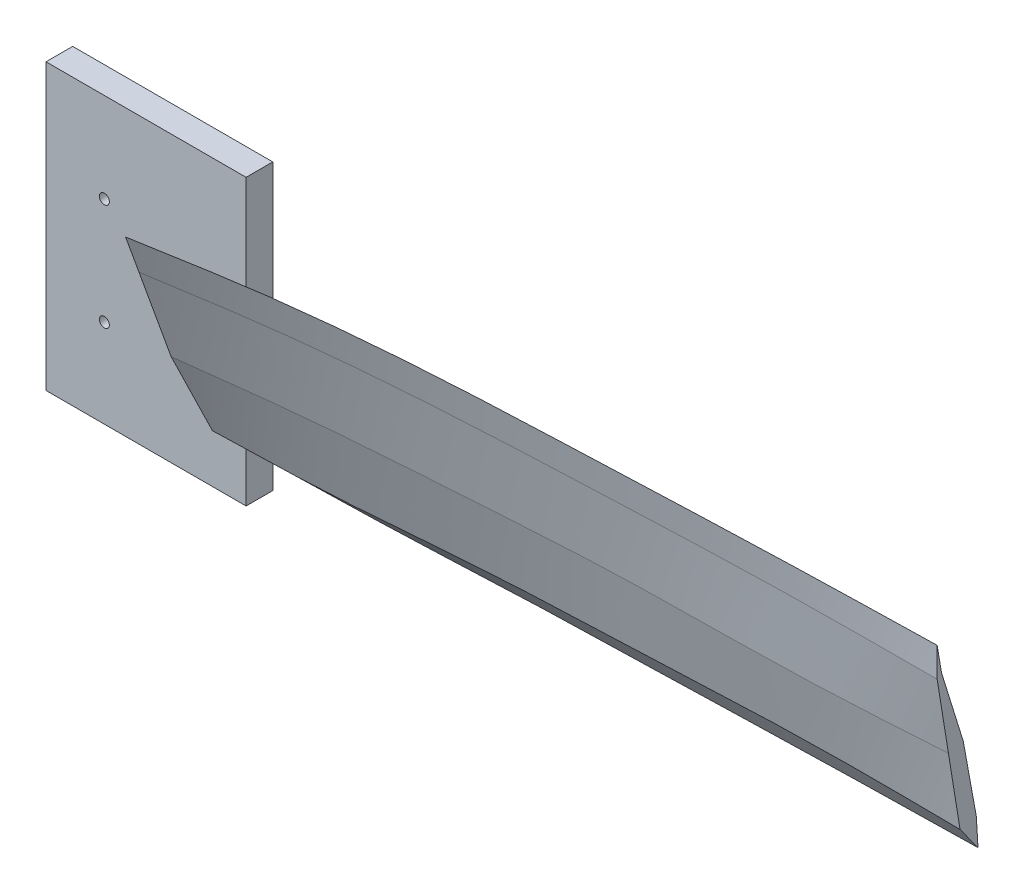
ISO-10303-21;
HEADER;
FILE_DESCRIPTION(('STEP AP214'),'2;1');
FILE_NAME('part.step','',(''),(''),'','','');
FILE_SCHEMA(('AUTOMOTIVE_DESIGN { 1 0 10303 214 1 1 1 1 }'));
ENDSEC;
DATA;
#1=APPLICATION_CONTEXT('core data for automotive mechanical design processes');
#2=APPLICATION_PROTOCOL_DEFINITION('international standard','automotive_design',2000,#1);
#3=PRODUCT_CONTEXT('',#1,'mechanical');
#4=PRODUCT('Part','Part','',(#3));
#5=PRODUCT_RELATED_PRODUCT_CATEGORY('part','',(#4));
#6=PRODUCT_DEFINITION_FORMATION('','',#4);
#7=PRODUCT_DEFINITION_CONTEXT('part definition',#1,'design');
#8=PRODUCT_DEFINITION('design','',#6,#7);
#9=PRODUCT_DEFINITION_SHAPE('','',#8);
#10=(LENGTH_UNIT() NAMED_UNIT(*) SI_UNIT(.MILLI.,.METRE.));
#11=(NAMED_UNIT(*) PLANE_ANGLE_UNIT() SI_UNIT($,.RADIAN.));
#12=(NAMED_UNIT(*) SI_UNIT($,.STERADIAN.) SOLID_ANGLE_UNIT());
#13=UNCERTAINTY_MEASURE_WITH_UNIT(LENGTH_MEASURE(1.E-05),#10,'distance_accuracy_value','');
#14=(GEOMETRIC_REPRESENTATION_CONTEXT(3) GLOBAL_UNCERTAINTY_ASSIGNED_CONTEXT((#13)) GLOBAL_UNIT_ASSIGNED_CONTEXT((#10,
#11,#12)) REPRESENTATION_CONTEXT('',''));
#15=CARTESIAN_POINT('',(0.,0.,0.));
#16=DIRECTION('',(0.,0.,1.));
#17=DIRECTION('',(1.,0.,0.));
#18=AXIS2_PLACEMENT_3D('',#15,#16,#17);
#19=CARTESIAN_POINT('',(560.,0.,0.));
#20=DIRECTION('',(-1.,0.,0.));
#21=DIRECTION('',(0.,0.,1.));
#22=AXIS2_PLACEMENT_3D('',#19,#20,#21);
#23=PLANE('',#22);
#24=DIRECTION('',(0.,0.888970009063461,0.457965416800996));
#25=VECTOR('',#24,1.);
#26=CARTESIAN_POINT('',(560.,318.712767483868,62.1867017358602));
#27=LINE('',#26,#25);
#28=CARTESIAN_POINT('',(560.,275.645514543704,40.));
#29=VERTEX_POINT('',#28);
#30=CARTESIAN_POINT('',(560.,318.712767483868,62.1867017358602));
#31=VERTEX_POINT('',#30);
#32=EDGE_CURVE('E558',#29,#31,#27,.T.);
#33=ORIENTED_EDGE('',*,*,#32,.F.);
#34=DIRECTION('',(0.,-1.,0.));
#35=VECTOR('',#34,1.);
#36=CARTESIAN_POINT('',(560.,0.,40.));
#37=LINE('',#36,#35);
#38=CARTESIAN_POINT('',(560.,245.963597017309,40.));
#39=VERTEX_POINT('',#38);
#40=EDGE_CURVE('E187',#29,#39,#37,.T.);
#41=ORIENTED_EDGE('',*,*,#40,.T.);
#42=DIRECTION('',(0.,-0.657102806210162,-0.753800969799542));
#43=VECTOR('',#42,1.);
#44=CARTESIAN_POINT('',(560.,242.476720069486,36.));
#45=LINE('',#44,#43);
#46=CARTESIAN_POINT('',(560.,259.193473035694,55.1767627207436));
#47=VERTEX_POINT('',#46);
#48=EDGE_CURVE('E356',#47,#39,#45,.T.);
#49=ORIENTED_EDGE('',*,*,#48,.F.);
#50=DIRECTION('',(0.,-0.899000770728051,-0.437947045007009));
#51=VECTOR('',#50,1.);
#52=CARTESIAN_POINT('',(560.,259.193473035694,55.1767627207436));
#53=LINE('',#52,#51);
#54=CARTESIAN_POINT('',(560.,310.048641997705,79.950791504065));
#55=VERTEX_POINT('',#54);
#56=EDGE_CURVE('E348',#55,#47,#53,.T.);
#57=ORIENTED_EDGE('',*,*,#56,.F.);
#58=DIRECTION('',(0.,-0.940783150676869,-0.33900894295358));
#59=VECTOR('',#58,1.);
#60=CARTESIAN_POINT('',(560.,310.048641997705,79.950791504065));
#61=LINE('',#60,#59);
#62=CARTESIAN_POINT('',(560.,363.578810346415,99.2402587686165));
#63=VERTEX_POINT('',#62);
#64=EDGE_CURVE('E360',#63,#55,#61,.T.);
#65=ORIENTED_EDGE('',*,*,#64,.F.);
#66=DIRECTION('',(0.,-0.940783150676869,-0.33900894295358));
#67=VECTOR('',#66,1.);
#68=CARTESIAN_POINT('',(560.,363.578810346415,99.2402587686165));
#69=LINE('',#68,#67);
#70=CARTESIAN_POINT('',(560.,385.850990865073,107.265985387412));
#71=VERTEX_POINT('',#70);
#72=EDGE_CURVE('E361',#71,#63,#69,.T.);
#73=ORIENTED_EDGE('',*,*,#72,.F.);
#74=DIRECTION('',(0.,0.795330776718136,0.606175680479617));
#75=VECTOR('',#74,1.);
#76=CARTESIAN_POINT('',(560.,385.850990865073,107.265985387412));
#77=LINE('',#76,#75);
#78=CARTESIAN_POINT('',(560.,366.108847996256,92.2191555174399));
#79=VERTEX_POINT('',#78);
#80=EDGE_CURVE('E512',#79,#71,#77,.T.);
#81=ORIENTED_EDGE('',*,*,#80,.F.);
#82=DIRECTION('',(0.,0.844698728855315,0.535242055027644));
#83=VECTOR('',#82,1.);
#84=CARTESIAN_POINT('',(560.,366.108847996256,92.2191555174399));
#85=LINE('',#84,#83);
#86=EDGE_CURVE('E534',#31,#79,#85,.T.);
#87=ORIENTED_EDGE('',*,*,#86,.F.);
#88=EDGE_LOOP('',(#33,#41,#49,#57,#65,#73,#81,#87));
#89=FACE_BOUND('',#88,.T.);
#90=ADVANCED_FACE('F60',(#89),#23,.T.);
#91=CARTESIAN_POINT('',(560.,242.476720069486,36.));
#92=CARTESIAN_POINT('',(583.321038326853,242.247053764258,36.));
#93=CARTESIAN_POINT('',(636.546262269638,241.722890116114,36.));
#94=CARTESIAN_POINT('',(719.920601459699,246.506315139028,36.));
#95=CARTESIAN_POINT('',(813.298884772352,248.567004995564,36.));
#96=CARTESIAN_POINT('',(906.629115173712,251.40309905308,36.));
#97=CARTESIAN_POINT('',(969.995615544042,252.519966778671,36.));
#98=CARTESIAN_POINT('',(1000.,253.048809754521,36.));
#99=CARTESIAN_POINT('',(560.,267.880998041361,36.));
#100=CARTESIAN_POINT('',(583.321038326853,267.871636422898,35.9951772304379));
#101=CARTESIAN_POINT('',(636.546262269638,267.850270554356,35.9841703024284));
#102=CARTESIAN_POINT('',(719.920601459699,268.045251703056,36.0846175865015));
#103=CARTESIAN_POINT('',(813.298884772352,267.242959475701,35.6713054493643));
#104=CARTESIAN_POINT('',(906.629115173712,270.440672814796,37.3186524995664));
#105=CARTESIAN_POINT('',(969.995615544042,270.034153406977,37.1092283028651));
#106=CARTESIAN_POINT('',(1000.,269.841664244253,37.0100648004549));
#107=B_SPLINE_SURFACE_WITH_KNOTS('',1,3,((#91,#92,#93,#94,#95,#96,#97,#98),(#99,#100,#101,#102,
#103,#104,#105,#106)),.UNSPECIFIED.,.F.,.F.,.F.,(2,2),(4,1,1,1,1,4),(0.,1.),(0.,
0.159714357389176,0.364513462898817,0.568936279057056,0.795888970787405,1.),.UNSPECIFIED.);
#108=CARTESIAN_POINT('',(560.,242.476720069486,36.));
#109=CARTESIAN_POINT('',(583.321038326853,242.247053764258,36.));
#110=CARTESIAN_POINT('',(636.546262269638,241.722890116114,36.));
#111=CARTESIAN_POINT('',(719.920601459699,246.506315139028,36.));
#112=CARTESIAN_POINT('',(813.298884772352,248.567004995564,36.));
#113=CARTESIAN_POINT('',(906.629115173712,251.40309905308,36.));
#114=CARTESIAN_POINT('',(969.995615544042,252.519966778671,36.));
#115=CARTESIAN_POINT('',(1000.,253.048809754521,36.));
#116=B_SPLINE_CURVE_WITH_KNOTS('',3,(#108,#109,#110,#111,#112,#113,#114,#115),.UNSPECIFIED.,.F.,
.F.,(4,1,1,1,1,4),(0.,0.159714357389176,0.364513462898817,0.568936279057056,0.795888970787405,
1.),.UNSPECIFIED.);
#117=CARTESIAN_POINT('',(1000.,253.048809754521,36.));
#118=VERTEX_POINT('',#117);
#119=CARTESIAN_POINT('',(565.014997147387,242.427586114534,36.));
#120=VERTEX_POINT('',#119);
#121=EDGE_CURVE('E557',#118,#120,#116,.F.);
#122=CARTESIAN_POINT('',(565.014997147387,242.427586114534,36.));
#123=CARTESIAN_POINT('',(565.014997147387,244.604868215543,35.9999117359562));
#124=CARTESIAN_POINT('',(565.014997147387,246.782150316553,35.9998234719123));
#125=CARTESIAN_POINT('',(565.014997147387,251.136714518571,35.9996469438247));
#126=CARTESIAN_POINT('',(565.014997147387,253.313996619581,35.9995586797808));
#127=CARTESIAN_POINT('',(565.014997147388,259.620517564238,35.9993030220317));
#128=CARTESIAN_POINT('',(565.014997147388,263.749756407886,35.9991356283265));
#129=CARTESIAN_POINT('',(565.014997147387,267.878995251534,35.9989682346212));
#130=B_SPLINE_CURVE_WITH_KNOTS('',3,(#122,#123,#124,#125,#126,#127,#128,#129),.UNSPECIFIED.,.F.,
.F.,(4,2,2,4),(0.,6.53184630839515,13.0636926167903,25.4514091579128),.UNSPECIFIED.);
#131=CARTESIAN_POINT('',(565.014997147387,267.878995251534,35.9989682346212));
#132=VERTEX_POINT('',#131);
#133=EDGE_CURVE('E200',#120,#132,#130,.T.);
#134=CARTESIAN_POINT('',(560.,267.880998041361,36.));
#135=CARTESIAN_POINT('',(583.321038326853,267.871636422898,35.9951772304379));
#136=CARTESIAN_POINT('',(636.546262269638,267.850270554356,35.9841703024284));
#137=CARTESIAN_POINT('',(719.920601459699,268.045251703056,36.0846175865015));
#138=CARTESIAN_POINT('',(813.298884772352,267.242959475701,35.6713054493643));
#139=CARTESIAN_POINT('',(906.629115173712,270.440672814796,37.3186524995664));
#140=CARTESIAN_POINT('',(969.995615544042,270.034153406977,37.1092283028651));
#141=CARTESIAN_POINT('',(1000.,269.841664244253,37.0100648004549));
#142=B_SPLINE_CURVE_WITH_KNOTS('',3,(#134,#135,#136,#137,#138,#139,#140,#141),.UNSPECIFIED.,.F.,
.F.,(4,1,1,1,1,4),(0.,0.159714357389176,0.364513462898817,0.568936279057056,0.795888970787405,
1.),.UNSPECIFIED.);
#143=CARTESIAN_POINT('',(1000.,269.841664244253,37.0100648004548));
#144=VERTEX_POINT('',#143);
#145=EDGE_CURVE('E81',#132,#144,#142,.T.);
#146=DIRECTION('',(0.,0.998195973255977,0.0600399781441655));
#147=VECTOR('',#146,1.);
#148=CARTESIAN_POINT('',(1000.,269.841664244253,37.0100648004548));
#149=LINE('',#148,#147);
#150=EDGE_CURVE('E281',#118,#144,#149,.T.);
#151=ORIENTED_EDGE('',*,*,#121,.T.);
#152=ORIENTED_EDGE('',*,*,#133,.T.);
#153=ORIENTED_EDGE('',*,*,#145,.T.);
#154=ORIENTED_EDGE('',*,*,#150,.F.);
#155=EDGE_LOOP('',(#151,#152,#153,#154));
#156=FACE_BOUND('',#155,.T.);
#157=ADVANCED_FACE('F292',(#156),#107,.T.);
#158=CARTESIAN_POINT('',(560.,267.880998041361,36.));
#159=CARTESIAN_POINT('',(583.321038326853,267.871636422898,35.9951772304378));
#160=CARTESIAN_POINT('',(636.546262269638,267.850270554356,35.9841703024284));
#161=CARTESIAN_POINT('',(719.920601459699,268.045251703056,36.0846175865015));
#162=CARTESIAN_POINT('',(813.298884772352,267.242959475701,35.6713054493643));
#163=CARTESIAN_POINT('',(906.629115173712,270.440672814796,37.3186524995664));
#164=CARTESIAN_POINT('',(969.995615544042,270.034153406977,37.1092283028651));
#165=CARTESIAN_POINT('',(1000.,269.841664244253,37.0100648004549));
#166=CARTESIAN_POINT('',(560.,318.712767483868,62.1867017358602));
#167=CARTESIAN_POINT('',(583.321038326853,318.251363375038,60.2354639609295));
#168=CARTESIAN_POINT('',(636.546262269638,317.19830833193,55.782185934422));
#169=CARTESIAN_POINT('',(719.920601459699,315.800787661832,49.2666800141121));
#170=CARTESIAN_POINT('',(813.298884772352,314.413012366936,48.6561987858021));
#171=CARTESIAN_POINT('',(906.629115173712,313.388515689035,46.8957844012968));
#172=CARTESIAN_POINT('',(969.995615544042,312.940520254511,45.4962296228803));
#173=CARTESIAN_POINT('',(1000.,312.728391966324,44.833532781594));
#174=B_SPLINE_SURFACE_WITH_KNOTS('',1,3,((#158,#159,#160,#161,#162,#163,#164,#165),(#166,#167,
#168,#169,#170,#171,#172,#173)),.UNSPECIFIED.,.F.,.F.,.F.,(2,2),(4,1,1,1,1,4),(0.,1.),(0.,
0.159714357389176,0.364513462898817,0.568936279057056,0.795888970787405,1.),.UNSPECIFIED.);
#175=CARTESIAN_POINT('',(565.014997147387,267.878995251534,35.9989682346212));
#176=CARTESIAN_POINT('',(565.014997147387,270.504853698338,37.3326454897475));
#177=CARTESIAN_POINT('',(565.014997147387,273.130712145143,38.6663227448737));
#178=CARTESIAN_POINT('',(565.014997147387,275.756570591948,40.));
#179=B_SPLINE_CURVE_WITH_KNOTS('',3,(#175,#176,#177,#178),.UNSPECIFIED.,.F.,.F.,(4,4),(0.,
8.83540878689111),.UNSPECIFIED.);
#180=CARTESIAN_POINT('',(565.014997147387,275.756570591948,40.));
#181=VERTEX_POINT('',#180);
#182=EDGE_CURVE('E556',#132,#181,#179,.T.);
#183=CARTESIAN_POINT('',(565.014997147387,275.756570591948,40.));
#184=CARTESIAN_POINT('',(564.179170969718,275.737759589122,40.));
#185=CARTESIAN_POINT('',(563.343341451935,275.719099417023,40.));
#186=CARTESIAN_POINT('',(561.671675736139,275.682080734275,40.));
#187=CARTESIAN_POINT('',(560.835839538127,275.663722223627,40.));
#188=CARTESIAN_POINT('',(560.,275.645514543704,40.));
#189=B_SPLINE_CURVE_WITH_KNOTS('',3,(#183,#184,#185,#186,#187,#188),.UNSPECIFIED.,.F.,.F.,(4,2,
4),(0.,2.50811336733175,5.01622673466357),.UNSPECIFIED.);
#190=EDGE_CURVE('E186',#181,#29,#189,.T.);
#191=CARTESIAN_POINT('',(560.,318.712767483868,62.1867017358602));
#192=CARTESIAN_POINT('',(583.321038326853,318.251363375038,60.2354639609295));
#193=CARTESIAN_POINT('',(636.546262269638,317.19830833193,55.782185934422));
#194=CARTESIAN_POINT('',(719.920601459699,315.800787661832,49.2666800141121));
#195=CARTESIAN_POINT('',(813.298884772352,314.413012366936,48.6561987858021));
#196=CARTESIAN_POINT('',(906.629115173712,313.388515689035,46.8957844012968));
#197=CARTESIAN_POINT('',(969.995615544042,312.940520254511,45.4962296228803));
#198=CARTESIAN_POINT('',(1000.,312.728391966324,44.833532781594));
#199=B_SPLINE_CURVE_WITH_KNOTS('',3,(#191,#192,#193,#194,#195,#196,#197,#198),.UNSPECIFIED.,.F.,
.F.,(4,1,1,1,1,4),(0.,0.159714357389176,0.364513462898817,0.568936279057056,0.795888970787405,
1.),.UNSPECIFIED.);
#200=CARTESIAN_POINT('',(1000.,312.728391966324,44.833532781594));
#201=VERTEX_POINT('',#200);
#202=EDGE_CURVE('E523',#31,#201,#199,.T.);
#203=DIRECTION('',(0.,0.983765254761362,0.179460088945463));
#204=VECTOR('',#203,1.);
#205=CARTESIAN_POINT('',(1000.,312.728391966324,44.833532781594));
#206=LINE('',#205,#204);
#207=EDGE_CURVE('E593',#144,#201,#206,.T.);
#208=ORIENTED_EDGE('',*,*,#145,.F.);
#209=ORIENTED_EDGE('',*,*,#182,.T.);
#210=ORIENTED_EDGE('',*,*,#190,.T.);
#211=ORIENTED_EDGE('',*,*,#32,.T.);
#212=ORIENTED_EDGE('',*,*,#202,.T.);
#213=ORIENTED_EDGE('',*,*,#207,.F.);
#214=EDGE_LOOP('',(#208,#209,#210,#211,#212,#213));
#215=FACE_BOUND('',#214,.T.);
#216=ADVANCED_FACE('F214',(#215),#174,.T.);
#217=CARTESIAN_POINT('',(560.,259.193473035694,55.1767627207436));
#218=CARTESIAN_POINT('',(583.321038326853,259.274526449523,54.6920479365808));
#219=CARTESIAN_POINT('',(636.546262269638,259.459513328834,53.5857913208219));
#220=CARTESIAN_POINT('',(719.920601459699,263.966153237829,49.8762704483908));
#221=CARTESIAN_POINT('',(813.298884772352,265.648427251533,48.6081685943915));
#222=CARTESIAN_POINT('',(906.629115173712,268.395611726468,46.3531443191992));
#223=CARTESIAN_POINT('',(969.995615544042,268.046367223446,46.6398214024016));
#224=CARTESIAN_POINT('',(1000.,267.880998041361,46.7755645690409));
#225=CARTESIAN_POINT('',(560.,242.476720069486,36.));
#226=CARTESIAN_POINT('',(583.321038326853,242.247053764258,36.));
#227=CARTESIAN_POINT('',(636.546262269638,241.722890116114,36.));
#228=CARTESIAN_POINT('',(719.920601459699,246.506315139028,36.));
#229=CARTESIAN_POINT('',(813.298884772352,248.567004995564,36.));
#230=CARTESIAN_POINT('',(906.629115173712,251.40309905308,36.));
#231=CARTESIAN_POINT('',(969.995615544042,252.519966778671,36.));
#232=CARTESIAN_POINT('',(1000.,253.048809754521,36.));
#233=B_SPLINE_SURFACE_WITH_KNOTS('',1,3,((#217,#218,#219,#220,#221,#222,#223,#224),(#225,#226,
#227,#228,#229,#230,#231,#232)),.UNSPECIFIED.,.F.,.F.,.F.,(2,2),(4,1,1,1,1,4),(0.,1.),(0.,
0.159714357389176,0.364513462898817,0.568936279057056,0.795888970787405,1.),.UNSPECIFIED.);
#234=CARTESIAN_POINT('',(560.,245.963597017309,40.));
#235=CARTESIAN_POINT('',(560.83583255572,245.960825834808,40.));
#236=CARTESIAN_POINT('',(561.671665262529,245.958101829409,40.));
#237=CARTESIAN_POINT('',(563.343330978325,245.952748172816,40.));
#238=CARTESIAN_POINT('',(564.179163987312,245.950118521622,40.));
#239=CARTESIAN_POINT('',(565.014997147387,245.947536047529,40.));
#240=B_SPLINE_CURVE_WITH_KNOTS('',3,(#234,#235,#236,#237,#238,#239),.UNSPECIFIED.,.F.,.F.,(4,2,
4),(0.,2.50751143682238,5.01502287364468),.UNSPECIFIED.);
#241=CARTESIAN_POINT('',(565.014997147387,245.947536047529,40.));
#242=VERTEX_POINT('',#241);
#243=EDGE_CURVE('E70',#39,#242,#240,.T.);
#244=CARTESIAN_POINT('',(565.014997147387,245.947536047529,40.));
#245=CARTESIAN_POINT('',(565.014997147387,244.774219403197,38.6666666666667));
#246=CARTESIAN_POINT('',(565.014997147387,243.600902758866,37.3333333333333));
#247=CARTESIAN_POINT('',(565.014997147387,242.427586114534,36.));
#248=B_SPLINE_CURVE_WITH_KNOTS('',3,(#244,#245,#246,#247),.UNSPECIFIED.,.F.,.F.,(4,4),(0.,
5.32823118218367),.UNSPECIFIED.);
#249=EDGE_CURVE('E12',#242,#120,#248,.T.);
#250=DIRECTION('',(0.,-0.809033879853263,-0.587762010723367));
#251=VECTOR('',#250,1.);
#252=CARTESIAN_POINT('',(1000.,253.048809754521,36.));
#253=LINE('',#252,#251);
#254=CARTESIAN_POINT('',(1000.,267.880998041361,46.7755645690408));
#255=VERTEX_POINT('',#254);
#256=EDGE_CURVE('E615',#255,#118,#253,.T.);
#257=CARTESIAN_POINT('',(560.,259.193473035694,55.1767627207436));
#258=CARTESIAN_POINT('',(583.321038326853,259.274526449523,54.6920479365808));
#259=CARTESIAN_POINT('',(636.546262269638,259.459513328834,53.5857913208219));
#260=CARTESIAN_POINT('',(719.920601459699,263.966153237829,49.8762704483908));
#261=CARTESIAN_POINT('',(813.298884772352,265.648427251533,48.6081685943915));
#262=CARTESIAN_POINT('',(906.629115173712,268.395611726468,46.3531443191992));
#263=CARTESIAN_POINT('',(969.995615544042,268.046367223446,46.6398214024016));
#264=CARTESIAN_POINT('',(1000.,267.880998041361,46.7755645690409));
#265=B_SPLINE_CURVE_WITH_KNOTS('',3,(#257,#258,#259,#260,#261,#262,#263,#264),.UNSPECIFIED.,.F.,
.F.,(4,1,1,1,1,4),(0.,0.159714357389176,0.364513462898817,0.568936279057056,0.795888970787405,
1.),.UNSPECIFIED.);
#266=EDGE_CURVE('E392',#47,#255,#265,.T.);
#267=ORIENTED_EDGE('',*,*,#243,.T.);
#268=ORIENTED_EDGE('',*,*,#249,.T.);
#269=ORIENTED_EDGE('',*,*,#121,.F.);
#270=ORIENTED_EDGE('',*,*,#256,.F.);
#271=ORIENTED_EDGE('',*,*,#266,.F.);
#272=ORIENTED_EDGE('',*,*,#48,.T.);
#273=EDGE_LOOP('',(#267,#268,#269,#270,#271,#272));
#274=FACE_BOUND('',#273,.T.);
#275=ADVANCED_FACE('F241',(#274),#233,.T.);
#276=CARTESIAN_POINT('',(1000.,0.,0.));
#277=DIRECTION('',(-1.,0.,0.));
#278=DIRECTION('',(0.,0.,1.));
#279=AXIS2_PLACEMENT_3D('',#276,#277,#278);
#280=PLANE('',#279);
#281=ORIENTED_EDGE('',*,*,#150,.T.);
#282=ORIENTED_EDGE('',*,*,#207,.T.);
#283=DIRECTION('',(0.,0.955159914090533,0.2960904228687));
#284=VECTOR('',#283,1.);
#285=CARTESIAN_POINT('',(1000.,354.78833164416,57.8717111445337));
#286=LINE('',#285,#284);
#287=CARTESIAN_POINT('',(1000.,354.78833164416,57.8717111445337));
#288=VERTEX_POINT('',#287);
#289=EDGE_CURVE('E592',#201,#288,#286,.T.);
#290=ORIENTED_EDGE('',*,*,#289,.T.);
#291=DIRECTION('',(0.,0.986094443152022,0.166185887441456));
#292=VECTOR('',#291,1.);
#293=CARTESIAN_POINT('',(1000.,370.403050067095,60.5032499958929));
#294=LINE('',#293,#292);
#295=CARTESIAN_POINT('',(1000.,370.403050067095,60.5032499958929));
#296=VERTEX_POINT('',#295);
#297=EDGE_CURVE('E597',#288,#296,#294,.T.);
#298=ORIENTED_EDGE('',*,*,#297,.T.);
#299=DIRECTION('',(0.,-1.,0.));
#300=VECTOR('',#299,1.);
#301=CARTESIAN_POINT('',(1000.,352.793207756721,60.5032499958929));
#302=LINE('',#301,#300);
#303=CARTESIAN_POINT('',(1000.,352.793207756721,60.5032499958929));
#304=VERTEX_POINT('',#303);
#305=EDGE_CURVE('E645',#296,#304,#302,.T.);
#306=ORIENTED_EDGE('',*,*,#305,.T.);
#307=DIRECTION('',(0.,-0.987182263567185,-0.159596925090581));
#308=VECTOR('',#307,1.);
#309=CARTESIAN_POINT('',(1000.,310.920538438747,53.7337308147689));
#310=LINE('',#309,#308);
#311=CARTESIAN_POINT('',(1000.,310.920538438747,53.7337308147689));
#312=VERTEX_POINT('',#311);
#313=EDGE_CURVE('E447',#304,#312,#310,.T.);
#314=ORIENTED_EDGE('',*,*,#313,.T.);
#315=DIRECTION('',(0.,-0.987182263567185,-0.159596925090581));
#316=VECTOR('',#315,1.);
#317=CARTESIAN_POINT('',(1000.,267.880998041361,46.7755645690408));
#318=LINE('',#317,#316);
#319=EDGE_CURVE('E386',#312,#255,#318,.T.);
#320=ORIENTED_EDGE('',*,*,#319,.T.);
#321=ORIENTED_EDGE('',*,*,#256,.T.);
#322=EDGE_LOOP('',(#281,#282,#290,#298,#306,#314,#320,#321));
#323=FACE_BOUND('',#322,.T.);
#324=ADVANCED_FACE('F56',(#323),#280,.F.);
#325=CARTESIAN_POINT('',(560.,318.712767483868,62.1867017358602));
#326=CARTESIAN_POINT('',(583.321038326853,318.251363375038,60.2354639609295));
#327=CARTESIAN_POINT('',(636.546262269638,317.19830833193,55.782185934422));
#328=CARTESIAN_POINT('',(719.920601459699,315.800787661832,49.2666800141121));
#329=CARTESIAN_POINT('',(813.298884772352,314.413012366936,48.6561987858021));
#330=CARTESIAN_POINT('',(906.629115173712,313.388515689035,46.8957844012968));
#331=CARTESIAN_POINT('',(969.995615544042,312.940520254511,45.4962296228803));
#332=CARTESIAN_POINT('',(1000.,312.728391966324,44.833532781594));
#333=CARTESIAN_POINT('',(560.,366.108847996256,92.2191555174399));
#334=CARTESIAN_POINT('',(583.321038326853,365.607698851141,88.3972860555825));
#335=CARTESIAN_POINT('',(636.546262269638,364.463934362458,79.6746959574723));
#336=CARTESIAN_POINT('',(719.920601459699,362.017964436946,70.8704802560284));
#337=CARTESIAN_POINT('',(813.298884772352,356.820240209838,64.1345072280728));
#338=CARTESIAN_POINT('',(906.629115173712,354.319971151606,56.42811948495));
#339=CARTESIAN_POINT('',(969.995615544042,354.637825752428,57.4078183664782));
#340=CARTESIAN_POINT('',(1000.,354.78833164416,57.8717111445337));
#341=B_SPLINE_SURFACE_WITH_KNOTS('',1,3,((#325,#326,#327,#328,#329,#330,#331,#332),(#333,#334,
#335,#336,#337,#338,#339,#340)),.UNSPECIFIED.,.F.,.F.,.F.,(2,2),(4,1,1,1,1,4),(0.,1.),(0.,
0.159714357389176,0.364513462898817,0.568936279057056,0.795888970787405,1.),.UNSPECIFIED.);
#342=CARTESIAN_POINT('',(560.,366.108847996256,92.2191555174399));
#343=CARTESIAN_POINT('',(583.321038326853,365.607698851141,88.3972860555825));
#344=CARTESIAN_POINT('',(636.546262269638,364.463934362458,79.6746959574723));
#345=CARTESIAN_POINT('',(719.920601459699,362.017964436946,70.8704802560284));
#346=CARTESIAN_POINT('',(813.298884772352,356.820240209838,64.1345072280728));
#347=CARTESIAN_POINT('',(906.629115173712,354.319971151606,56.42811948495));
#348=CARTESIAN_POINT('',(969.995615544042,354.637825752428,57.4078183664782));
#349=CARTESIAN_POINT('',(1000.,354.78833164416,57.8717111445337));
#350=B_SPLINE_CURVE_WITH_KNOTS('',3,(#342,#343,#344,#345,#346,#347,#348,#349),.UNSPECIFIED.,.F.,
.F.,(4,1,1,1,1,4),(0.,0.159714357389176,0.364513462898817,0.568936279057056,0.795888970787405,
1.),.UNSPECIFIED.);
#351=EDGE_CURVE('E496',#79,#288,#350,.T.);
#352=ORIENTED_EDGE('',*,*,#86,.T.);
#353=ORIENTED_EDGE('',*,*,#351,.T.);
#354=ORIENTED_EDGE('',*,*,#289,.F.);
#355=ORIENTED_EDGE('',*,*,#202,.F.);
#356=EDGE_LOOP('',(#352,#353,#354,#355));
#357=FACE_BOUND('',#356,.T.);
#358=ADVANCED_FACE('F253',(#357),#341,.T.);
#359=CARTESIAN_POINT('',(560.,366.108847996256,92.2191555174399));
#360=CARTESIAN_POINT('',(583.321038326853,365.607698851141,88.3972860555825));
#361=CARTESIAN_POINT('',(636.546262269638,364.463934362458,79.6746959574723));
#362=CARTESIAN_POINT('',(719.920601459699,362.017964436946,70.8704802560284));
#363=CARTESIAN_POINT('',(813.298884772352,356.820240209838,64.1345072280728));
#364=CARTESIAN_POINT('',(906.629115173712,354.319971151606,56.42811948495));
#365=CARTESIAN_POINT('',(969.995615544042,354.637825752428,57.4078183664782));
#366=CARTESIAN_POINT('',(1000.,354.78833164416,57.8717111445337));
#367=CARTESIAN_POINT('',(560.,385.850990865073,107.265985387412));
#368=CARTESIAN_POINT('',(583.321038326853,385.386386386187,102.606698847757));
#369=CARTESIAN_POINT('',(636.546262269638,384.326027190901,91.9728854638479));
#370=CARTESIAN_POINT('',(719.920601459699,380.911801098078,80.8140993550026));
#371=CARTESIAN_POINT('',(813.298884772352,376.486666283359,72.7460545165625));
#372=CARTESIAN_POINT('',(906.629115173712,373.017300961417,65.2182262798581));
#373=CARTESIAN_POINT('',(969.995615544042,371.243129809764,62.0183899818534));
#374=CARTESIAN_POINT('',(1000.,370.403050067095,60.5032499958929));
#375=B_SPLINE_SURFACE_WITH_KNOTS('',1,3,((#359,#360,#361,#362,#363,#364,#365,#366),(#367,#368,
#369,#370,#371,#372,#373,#374)),.UNSPECIFIED.,.F.,.F.,.F.,(2,2),(4,1,1,1,1,4),(0.,1.),(0.,
0.159714357389176,0.364513462898817,0.568936279057056,0.795888970787405,1.),.UNSPECIFIED.);
#376=CARTESIAN_POINT('',(560.,385.850990865073,107.265985387412));
#377=CARTESIAN_POINT('',(583.321038326853,385.386386386187,102.606698847757));
#378=CARTESIAN_POINT('',(636.546262269638,384.326027190901,91.9728854638479));
#379=CARTESIAN_POINT('',(719.920601459699,380.911801098078,80.8140993550026));
#380=CARTESIAN_POINT('',(813.298884772352,376.486666283359,72.7460545165625));
#381=CARTESIAN_POINT('',(906.629115173712,373.017300961417,65.2182262798581));
#382=CARTESIAN_POINT('',(969.995615544042,371.243129809764,62.0183899818534));
#383=CARTESIAN_POINT('',(1000.,370.403050067095,60.5032499958929));
#384=B_SPLINE_CURVE_WITH_KNOTS('',3,(#376,#377,#378,#379,#380,#381,#382,#383),.UNSPECIFIED.,.F.,
.F.,(4,1,1,1,1,4),(0.,0.159714357389176,0.364513462898817,0.568936279057056,0.795888970787405,
1.),.UNSPECIFIED.);
#385=EDGE_CURVE('E391',#71,#296,#384,.T.);
#386=ORIENTED_EDGE('',*,*,#80,.T.);
#387=ORIENTED_EDGE('',*,*,#385,.T.);
#388=ORIENTED_EDGE('',*,*,#297,.F.);
#389=ORIENTED_EDGE('',*,*,#351,.F.);
#390=EDGE_LOOP('',(#386,#387,#388,#389));
#391=FACE_BOUND('',#390,.T.);
#392=ADVANCED_FACE('F465',(#391),#375,.T.);
#393=CARTESIAN_POINT('',(560.,385.850990865073,107.265985387412));
#394=CARTESIAN_POINT('',(583.321038326853,385.386386386187,102.606698847757));
#395=CARTESIAN_POINT('',(636.546262269638,384.326027190901,91.9728854638479));
#396=CARTESIAN_POINT('',(719.920601459699,380.911801098078,80.8140993550026));
#397=CARTESIAN_POINT('',(813.298884772352,376.486666283359,72.7460545165625));
#398=CARTESIAN_POINT('',(906.629115173712,373.017300961417,65.2182262798581));
#399=CARTESIAN_POINT('',(969.995615544042,371.243129809764,62.0183899818534));
#400=CARTESIAN_POINT('',(1000.,370.403050067095,60.5032499958929));
#401=CARTESIAN_POINT('',(560.,363.578810346415,99.2402587686165));
#402=CARTESIAN_POINT('',(583.321038326853,363.337612285466,95.1814050299867));
#403=CARTESIAN_POINT('',(636.546262269638,362.78712990005,85.9179495970939));
#404=CARTESIAN_POINT('',(719.920601459699,360.502130898742,76.3931183087345));
#405=CARTESIAN_POINT('',(813.298884772352,357.136839591929,69.0056069408765));
#406=CARTESIAN_POINT('',(906.629115173712,354.815842893389,62.7238807548386));
#407=CARTESIAN_POINT('',(969.995615544042,353.443173989425,61.2168413809386));
#408=CARTESIAN_POINT('',(1000.,352.793207756721,60.5032499958929));
#409=B_SPLINE_SURFACE_WITH_KNOTS('',1,3,((#393,#394,#395,#396,#397,#398,#399,#400),(#401,#402,
#403,#404,#405,#406,#407,#408)),.UNSPECIFIED.,.F.,.F.,.F.,(2,2),(4,1,1,1,1,4),(0.,1.),(0.,
0.159714357389176,0.364513462898817,0.568936279057056,0.795888970787405,1.),.UNSPECIFIED.);
#410=CARTESIAN_POINT('',(560.,363.578810346415,99.2402587686165));
#411=CARTESIAN_POINT('',(583.321038326853,363.337612285466,95.1814050299867));
#412=CARTESIAN_POINT('',(636.546262269638,362.78712990005,85.9179495970939));
#413=CARTESIAN_POINT('',(719.920601459699,360.502130898742,76.3931183087345));
#414=CARTESIAN_POINT('',(813.298884772352,357.136839591929,69.0056069408765));
#415=CARTESIAN_POINT('',(906.629115173712,354.815842893389,62.7238807548386));
#416=CARTESIAN_POINT('',(969.995615544042,353.443173989425,61.2168413809386));
#417=CARTESIAN_POINT('',(1000.,352.793207756721,60.5032499958929));
#418=B_SPLINE_CURVE_WITH_KNOTS('',3,(#410,#411,#412,#413,#414,#415,#416,#417),.UNSPECIFIED.,.F.,
.F.,(4,1,1,1,1,4),(0.,0.159714357389176,0.364513462898817,0.568936279057056,0.795888970787405,
1.),.UNSPECIFIED.);
#419=EDGE_CURVE('E379',#63,#304,#418,.T.);
#420=ORIENTED_EDGE('',*,*,#72,.T.);
#421=ORIENTED_EDGE('',*,*,#419,.T.);
#422=ORIENTED_EDGE('',*,*,#305,.F.);
#423=ORIENTED_EDGE('',*,*,#385,.F.);
#424=EDGE_LOOP('',(#420,#421,#422,#423));
#425=FACE_BOUND('',#424,.T.);
#426=ADVANCED_FACE('F455',(#425),#409,.T.);
#427=CARTESIAN_POINT('',(560.,363.578810346415,99.2402587686165));
#428=CARTESIAN_POINT('',(583.321038326853,363.337612285466,95.1814050299867));
#429=CARTESIAN_POINT('',(636.546262269638,362.78712990005,85.9179495970939));
#430=CARTESIAN_POINT('',(719.920601459699,360.502130898742,76.3931183087345));
#431=CARTESIAN_POINT('',(813.298884772352,357.136839591929,69.0056069408765));
#432=CARTESIAN_POINT('',(906.629115173712,354.815842893389,62.7238807548386));
#433=CARTESIAN_POINT('',(969.995615544042,353.443173989425,61.2168413809386));
#434=CARTESIAN_POINT('',(1000.,352.793207756721,60.5032499958929));
#435=CARTESIAN_POINT('',(560.,310.048641997705,79.950791504065));
#436=CARTESIAN_POINT('',(583.321038326853,310.346666062897,77.3263049012061));
#437=CARTESIAN_POINT('',(636.546262269638,311.026841507398,71.3364820976835));
#438=CARTESIAN_POINT('',(719.920601459699,311.152294156785,65.8462354395312));
#439=CARTESIAN_POINT('',(813.298884772352,311.476207768382,59.6446862081171));
#440=CARTESIAN_POINT('',(906.629115173712,309.907748730627,58.642854502961));
#441=CARTESIAN_POINT('',(969.995615544042,310.595082255784,55.3112593426008));
#442=CARTESIAN_POINT('',(1000.,310.920538438747,53.7337308147689));
#443=B_SPLINE_SURFACE_WITH_KNOTS('',1,3,((#427,#428,#429,#430,#431,#432,#433,#434),(#435,#436,
#437,#438,#439,#440,#441,#442)),.UNSPECIFIED.,.F.,.F.,.F.,(2,2),(4,1,1,1,1,4),(0.,1.),(0.,
0.159714357389176,0.364513462898817,0.568936279057056,0.795888970787405,1.),.UNSPECIFIED.);
#444=CARTESIAN_POINT('',(560.,310.048641997705,79.950791504065));
#445=CARTESIAN_POINT('',(583.321038326853,310.346666062897,77.3263049012061));
#446=CARTESIAN_POINT('',(636.546262269638,311.026841507398,71.3364820976835));
#447=CARTESIAN_POINT('',(719.920601459699,311.152294156785,65.8462354395312));
#448=CARTESIAN_POINT('',(813.298884772352,311.476207768382,59.6446862081171));
#449=CARTESIAN_POINT('',(906.629115173712,309.907748730627,58.642854502961));
#450=CARTESIAN_POINT('',(969.995615544042,310.595082255784,55.3112593426008));
#451=CARTESIAN_POINT('',(1000.,310.920538438747,53.7337308147689));
#452=B_SPLINE_CURVE_WITH_KNOTS('',3,(#444,#445,#446,#447,#448,#449,#450,#451),.UNSPECIFIED.,.F.,
.F.,(4,1,1,1,1,4),(0.,0.159714357389176,0.364513462898817,0.568936279057056,0.795888970787405,
1.),.UNSPECIFIED.);
#453=EDGE_CURVE('E378',#55,#312,#452,.T.);
#454=ORIENTED_EDGE('',*,*,#64,.T.);
#455=ORIENTED_EDGE('',*,*,#453,.T.);
#456=ORIENTED_EDGE('',*,*,#313,.F.);
#457=ORIENTED_EDGE('',*,*,#419,.F.);
#458=EDGE_LOOP('',(#454,#455,#456,#457));
#459=FACE_BOUND('',#458,.T.);
#460=ADVANCED_FACE('F376',(#459),#443,.T.);
#461=CARTESIAN_POINT('',(560.,310.048641997705,79.950791504065));
#462=CARTESIAN_POINT('',(583.321038326853,310.346666062897,77.3263049012061));
#463=CARTESIAN_POINT('',(636.546262269638,311.026841507398,71.3364820976835));
#464=CARTESIAN_POINT('',(719.920601459699,311.152294156785,65.8462354395312));
#465=CARTESIAN_POINT('',(813.298884772352,311.476207768382,59.6446862081171));
#466=CARTESIAN_POINT('',(906.629115173712,309.907748730627,58.642854502961));
#467=CARTESIAN_POINT('',(969.995615544042,310.595082255784,55.3112593426008));
#468=CARTESIAN_POINT('',(1000.,310.920538438747,53.7337308147689));
#469=CARTESIAN_POINT('',(560.,259.193473035694,55.1767627207436));
#470=CARTESIAN_POINT('',(583.321038326853,259.274526449523,54.6920479365808));
#471=CARTESIAN_POINT('',(636.546262269638,259.459513328834,53.5857913208219));
#472=CARTESIAN_POINT('',(719.920601459699,263.966153237829,49.8762704483908));
#473=CARTESIAN_POINT('',(813.298884772352,265.648427251533,48.6081685943915));
#474=CARTESIAN_POINT('',(906.629115173712,268.395611726468,46.3531443191992));
#475=CARTESIAN_POINT('',(969.995615544042,268.046367223446,46.6398214024016));
#476=CARTESIAN_POINT('',(1000.,267.880998041361,46.7755645690409));
#477=B_SPLINE_SURFACE_WITH_KNOTS('',1,3,((#461,#462,#463,#464,#465,#466,#467,#468),(#469,#470,
#471,#472,#473,#474,#475,#476)),.UNSPECIFIED.,.F.,.F.,.F.,(2,2),(4,1,1,1,1,4),(0.,1.),(0.,
0.159714357389176,0.364513462898817,0.568936279057056,0.795888970787405,1.),.UNSPECIFIED.);
#478=ORIENTED_EDGE('',*,*,#56,.T.);
#479=ORIENTED_EDGE('',*,*,#266,.T.);
#480=ORIENTED_EDGE('',*,*,#319,.F.);
#481=ORIENTED_EDGE('',*,*,#453,.F.);
#482=EDGE_LOOP('',(#478,#479,#480,#481));
#483=FACE_BOUND('',#482,.T.);
#484=ADVANCED_FACE('F384',(#483),#477,.T.);
#485=CARTESIAN_POINT('',(445.,215.,40.));
#486=DIRECTION('',(1.,0.,0.));
#487=DIRECTION('',(0.,0.,-1.));
#488=AXIS2_PLACEMENT_3D('',#485,#486,#487);
#489=PLANE('',#488);
#490=DIRECTION('',(0.,-1.,0.));
#491=VECTOR('',#490,1.);
#492=CARTESIAN_POINT('',(445.,215.,24.));
#493=LINE('',#492,#491);
#494=CARTESIAN_POINT('',(445.,385.751002075885,24.));
#495=VERTEX_POINT('',#494);
#496=CARTESIAN_POINT('',(445.,215.,24.));
#497=VERTEX_POINT('',#496);
#498=EDGE_CURVE('E183',#495,#497,#493,.T.);
#499=ORIENTED_EDGE('',*,*,#498,.T.);
#500=DIRECTION('',(0.,0.,-1.));
#501=VECTOR('',#500,1.);
#502=CARTESIAN_POINT('',(445.,215.,40.));
#503=LINE('',#502,#501);
#504=CARTESIAN_POINT('',(445.,215.,40.));
#505=VERTEX_POINT('',#504);
#506=EDGE_CURVE('E170',#505,#497,#503,.T.);
#507=ORIENTED_EDGE('',*,*,#506,.F.);
#508=DIRECTION('',(0.,-1.,0.));
#509=VECTOR('',#508,1.);
#510=CARTESIAN_POINT('',(445.,215.,40.));
#511=LINE('',#510,#509);
#512=CARTESIAN_POINT('',(445.,385.751002075885,40.));
#513=VERTEX_POINT('',#512);
#514=EDGE_CURVE('E175',#513,#505,#511,.T.);
#515=ORIENTED_EDGE('',*,*,#514,.F.);
#516=DIRECTION('',(0.,0.,-1.));
#517=VECTOR('',#516,1.);
#518=CARTESIAN_POINT('',(445.,385.751002075885,40.));
#519=LINE('',#518,#517);
#520=EDGE_CURVE('E580',#513,#495,#519,.T.);
#521=ORIENTED_EDGE('',*,*,#520,.T.);
#522=EDGE_LOOP('',(#499,#507,#515,#521));
#523=FACE_BOUND('',#522,.T.);
#524=ADVANCED_FACE('F181',(#523),#489,.F.);
#525=CARTESIAN_POINT('',(445.,215.,40.));
#526=DIRECTION('',(0.,1.,0.));
#527=DIRECTION('',(0.,0.,1.));
#528=AXIS2_PLACEMENT_3D('',#525,#526,#527);
#529=PLANE('',#528);
#530=DIRECTION('',(1.,0.,0.));
#531=VECTOR('',#530,1.);
#532=CARTESIAN_POINT('',(445.,215.,24.));
#533=LINE('',#532,#531);
#534=CARTESIAN_POINT('',(565.014997147387,215.,24.));
#535=VERTEX_POINT('',#534);
#536=EDGE_CURVE('E567',#497,#535,#533,.T.);
#537=ORIENTED_EDGE('',*,*,#536,.T.);
#538=DIRECTION('',(0.,0.,-1.));
#539=VECTOR('',#538,1.);
#540=CARTESIAN_POINT('',(565.014997147387,215.,40.));
#541=LINE('',#540,#539);
#542=CARTESIAN_POINT('',(565.014997147387,215.,40.));
#543=VERTEX_POINT('',#542);
#544=EDGE_CURVE('E168',#543,#535,#541,.T.);
#545=ORIENTED_EDGE('',*,*,#544,.F.);
#546=DIRECTION('',(1.,0.,0.));
#547=VECTOR('',#546,1.);
#548=CARTESIAN_POINT('',(445.,215.,40.));
#549=LINE('',#548,#547);
#550=EDGE_CURVE('E162',#505,#543,#549,.T.);
#551=ORIENTED_EDGE('',*,*,#550,.F.);
#552=ORIENTED_EDGE('',*,*,#506,.T.);
#553=EDGE_LOOP('',(#537,#545,#551,#552));
#554=FACE_BOUND('',#553,.T.);
#555=ADVANCED_FACE('F164',(#554),#529,.F.);
#556=CARTESIAN_POINT('',(565.014997147387,215.,40.));
#557=DIRECTION('',(-1.,0.,0.));
#558=DIRECTION('',(0.,0.,1.));
#559=AXIS2_PLACEMENT_3D('',#556,#557,#558);
#560=PLANE('',#559);
#561=ORIENTED_EDGE('',*,*,#182,.F.);
#562=ORIENTED_EDGE('',*,*,#133,.F.);
#563=ORIENTED_EDGE('',*,*,#249,.F.);
#564=DIRECTION('',(0.,1.,0.));
#565=VECTOR('',#564,1.);
#566=CARTESIAN_POINT('',(565.014997147387,215.,40.));
#567=LINE('',#566,#565);
#568=EDGE_CURVE('E73',#543,#242,#567,.T.);
#569=ORIENTED_EDGE('',*,*,#568,.F.);
#570=ORIENTED_EDGE('',*,*,#544,.T.);
#571=DIRECTION('',(0.,1.,0.));
#572=VECTOR('',#571,1.);
#573=CARTESIAN_POINT('',(565.014997147387,215.,24.));
#574=LINE('',#573,#572);
#575=CARTESIAN_POINT('',(565.014997147387,385.751002075885,24.));
#576=VERTEX_POINT('',#575);
#577=EDGE_CURVE('E577',#535,#576,#574,.T.);
#578=ORIENTED_EDGE('',*,*,#577,.T.);
#579=DIRECTION('',(0.,0.,-1.));
#580=VECTOR('',#579,1.);
#581=CARTESIAN_POINT('',(565.014997147387,385.751002075885,40.));
#582=LINE('',#581,#580);
#583=CARTESIAN_POINT('',(565.014997147387,385.751002075885,40.));
#584=VERTEX_POINT('',#583);
#585=EDGE_CURVE('E193',#584,#576,#582,.T.);
#586=ORIENTED_EDGE('',*,*,#585,.F.);
#587=EDGE_CURVE('E172',#181,#584,#567,.T.);
#588=ORIENTED_EDGE('',*,*,#587,.F.);
#589=EDGE_LOOP('',(#561,#562,#563,#569,#570,#578,#586,#588));
#590=FACE_BOUND('',#589,.T.);
#591=ADVANCED_FACE('F591',(#590),#560,.F.);
#592=CARTESIAN_POINT('',(445.,385.751002075885,40.));
#593=DIRECTION('',(0.,-1.,0.));
#594=DIRECTION('',(0.,0.,-1.));
#595=AXIS2_PLACEMENT_3D('',#592,#593,#594);
#596=PLANE('',#595);
#597=DIRECTION('',(-1.,0.,0.));
#598=VECTOR('',#597,1.);
#599=CARTESIAN_POINT('',(445.,385.751002075885,24.));
#600=LINE('',#599,#598);
#601=EDGE_CURVE('E182',#576,#495,#600,.T.);
#602=ORIENTED_EDGE('',*,*,#601,.T.);
#603=ORIENTED_EDGE('',*,*,#520,.F.);
#604=DIRECTION('',(-1.,0.,0.));
#605=VECTOR('',#604,1.);
#606=CARTESIAN_POINT('',(445.,385.751002075885,40.));
#607=LINE('',#606,#605);
#608=EDGE_CURVE('E180',#584,#513,#607,.T.);
#609=ORIENTED_EDGE('',*,*,#608,.F.);
#610=ORIENTED_EDGE('',*,*,#585,.T.);
#611=EDGE_LOOP('',(#602,#603,#609,#610));
#612=FACE_BOUND('',#611,.T.);
#613=ADVANCED_FACE('F223',(#612),#596,.F.);
#614=CARTESIAN_POINT('',(0.,0.,40.));
#615=DIRECTION('',(0.,0.,-1.));
#616=DIRECTION('',(-1.,0.,0.));
#617=AXIS2_PLACEMENT_3D('',#614,#615,#616);
#618=PLANE('',#617);
#619=CARTESIAN_POINT('',(480.,332.,40.));
#620=DIRECTION('',(0.,0.,1.));
#621=DIRECTION('',(1.,0.,0.));
#622=AXIS2_PLACEMENT_3D('',#619,#620,#621);
#623=CIRCLE('',#622,2.99999999999999);
#624=CARTESIAN_POINT('',(483.,332.,40.));
#625=VERTEX_POINT('',#624);
#626=EDGE_CURVE('E574',#625,#625,#623,.T.);
#627=ORIENTED_EDGE('',*,*,#626,.F.);
#628=EDGE_LOOP('',(#627));
#629=FACE_BOUND('',#628,.T.);
#630=CARTESIAN_POINT('',(480.,268.,40.));
#631=DIRECTION('',(0.,0.,1.));
#632=DIRECTION('',(1.,0.,0.));
#633=AXIS2_PLACEMENT_3D('',#630,#631,#632);
#634=CIRCLE('',#633,2.99999999999999);
#635=CARTESIAN_POINT('',(483.,268.,40.));
#636=VERTEX_POINT('',#635);
#637=EDGE_CURVE('E561',#636,#636,#634,.T.);
#638=ORIENTED_EDGE('',*,*,#637,.F.);
#639=EDGE_LOOP('',(#638));
#640=FACE_BOUND('',#639,.T.);
#641=ORIENTED_EDGE('',*,*,#190,.F.);
#642=ORIENTED_EDGE('',*,*,#587,.T.);
#643=ORIENTED_EDGE('',*,*,#608,.T.);
#644=ORIENTED_EDGE('',*,*,#514,.T.);
#645=ORIENTED_EDGE('',*,*,#550,.T.);
#646=ORIENTED_EDGE('',*,*,#568,.T.);
#647=ORIENTED_EDGE('',*,*,#243,.F.);
#648=ORIENTED_EDGE('',*,*,#40,.F.);
#649=EDGE_LOOP('',(#641,#642,#643,#644,#645,#646,#647,#648));
#650=FACE_BOUND('',#649,.T.);
#651=ADVANCED_FACE('F173',(#629,#640,#650),#618,.F.);
#652=CARTESIAN_POINT('',(0.,0.,24.));
#653=DIRECTION('',(0.,0.,-1.));
#654=DIRECTION('',(-1.,0.,0.));
#655=AXIS2_PLACEMENT_3D('',#652,#653,#654);
#656=PLANE('',#655);
#657=CARTESIAN_POINT('',(480.,332.,24.));
#658=DIRECTION('',(0.,0.,-1.));
#659=DIRECTION('',(-1.,0.,0.));
#660=AXIS2_PLACEMENT_3D('',#657,#658,#659);
#661=CIRCLE('',#660,2.99999999999999);
#662=CARTESIAN_POINT('',(477.,332.,24.));
#663=VERTEX_POINT('',#662);
#664=EDGE_CURVE('E65',#663,#663,#661,.T.);
#665=ORIENTED_EDGE('',*,*,#664,.F.);
#666=EDGE_LOOP('',(#665));
#667=FACE_BOUND('',#666,.T.);
#668=CARTESIAN_POINT('',(480.,268.,24.));
#669=DIRECTION('',(0.,0.,-1.));
#670=DIRECTION('',(-1.,0.,0.));
#671=AXIS2_PLACEMENT_3D('',#668,#669,#670);
#672=CIRCLE('',#671,2.99999999999999);
#673=CARTESIAN_POINT('',(483.,268.,24.));
#674=VERTEX_POINT('',#673);
#675=EDGE_CURVE('E563',#674,#674,#672,.T.);
#676=ORIENTED_EDGE('',*,*,#675,.F.);
#677=EDGE_LOOP('',(#676));
#678=FACE_BOUND('',#677,.T.);
#679=ORIENTED_EDGE('',*,*,#498,.F.);
#680=ORIENTED_EDGE('',*,*,#601,.F.);
#681=ORIENTED_EDGE('',*,*,#577,.F.);
#682=ORIENTED_EDGE('',*,*,#536,.F.);
#683=EDGE_LOOP('',(#679,#680,#681,#682));
#684=FACE_BOUND('',#683,.T.);
#685=ADVANCED_FACE('F221',(#667,#678,#684),#656,.T.);
#686=CARTESIAN_POINT('',(480.,268.,-63.266085387412));
#687=DIRECTION('',(0.,0.,1.));
#688=DIRECTION('',(1.,0.,0.));
#689=AXIS2_PLACEMENT_3D('',#686,#687,#688);
#690=CYLINDRICAL_SURFACE('',#689,2.99999999999999);
#691=CARTESIAN_POINT('',(483.,268.,24.));
#692=CARTESIAN_POINT('',(483.,268.,24.1666666666667));
#693=CARTESIAN_POINT('',(483.,268.,24.3333333333333));
#694=CARTESIAN_POINT('',(483.,268.,24.6666666666667));
#695=CARTESIAN_POINT('',(483.,268.,24.8333333333333));
#696=CARTESIAN_POINT('',(483.,268.,25.1666666666667));
#697=CARTESIAN_POINT('',(483.,268.,25.3333333333333));
#698=CARTESIAN_POINT('',(483.,268.,25.6666666666667));
#699=CARTESIAN_POINT('',(483.,268.,25.8333333333333));
#700=CARTESIAN_POINT('',(483.,268.,26.1666666666667));
#701=CARTESIAN_POINT('',(483.,268.,26.3333333333333));
#702=CARTESIAN_POINT('',(483.,268.,26.6666666666667));
#703=CARTESIAN_POINT('',(483.,268.,26.8333333333333));
#704=CARTESIAN_POINT('',(483.,268.,27.1666666666667));
#705=CARTESIAN_POINT('',(483.,268.,27.3333333333333));
#706=CARTESIAN_POINT('',(483.,268.,27.6666666666667));
#707=CARTESIAN_POINT('',(483.,268.,27.8333333333333));
#708=CARTESIAN_POINT('',(483.,268.,28.1666666666667));
#709=CARTESIAN_POINT('',(483.,268.,28.3333333333333));
#710=CARTESIAN_POINT('',(483.,268.,28.6666666666667));
#711=CARTESIAN_POINT('',(483.,268.,28.8333333333333));
#712=CARTESIAN_POINT('',(483.,268.,29.1666666666667));
#713=CARTESIAN_POINT('',(483.,268.,29.3333333333333));
#714=CARTESIAN_POINT('',(483.,268.,29.6666666666667));
#715=CARTESIAN_POINT('',(483.,268.,29.8333333333333));
#716=CARTESIAN_POINT('',(483.,268.,30.1666666666667));
#717=CARTESIAN_POINT('',(483.,268.,30.3333333333333));
#718=CARTESIAN_POINT('',(483.,268.,30.6666666666667));
#719=CARTESIAN_POINT('',(483.,268.,30.8333333333333));
#720=CARTESIAN_POINT('',(483.,268.,31.1666666666667));
#721=CARTESIAN_POINT('',(483.,268.,31.3333333333333));
#722=CARTESIAN_POINT('',(483.,268.,31.6666666666667));
#723=CARTESIAN_POINT('',(483.,268.,31.8333333333333));
#724=CARTESIAN_POINT('',(483.,268.,32.1666666666667));
#725=CARTESIAN_POINT('',(483.,268.,32.3333333333333));
#726=CARTESIAN_POINT('',(483.,268.,32.6666666666667));
#727=CARTESIAN_POINT('',(483.,268.,32.8333333333333));
#728=CARTESIAN_POINT('',(483.,268.,33.1666666666667));
#729=CARTESIAN_POINT('',(483.,268.,33.3333333333333));
#730=CARTESIAN_POINT('',(483.,268.,33.6666666666667));
#731=CARTESIAN_POINT('',(483.,268.,33.8333333333333));
#732=CARTESIAN_POINT('',(483.,268.,34.1666666666667));
#733=CARTESIAN_POINT('',(483.,268.,34.3333333333333));
#734=CARTESIAN_POINT('',(483.,268.,34.6666666666667));
#735=CARTESIAN_POINT('',(483.,268.,34.8333333333333));
#736=CARTESIAN_POINT('',(483.,268.,35.1666666666667));
#737=CARTESIAN_POINT('',(483.,268.,35.3333333333333));
#738=CARTESIAN_POINT('',(483.,268.,35.6666666666667));
#739=CARTESIAN_POINT('',(483.,268.,35.8333333333333));
#740=CARTESIAN_POINT('',(483.,268.,36.1666666666667));
#741=CARTESIAN_POINT('',(483.,268.,36.3333333333333));
#742=CARTESIAN_POINT('',(483.,268.,36.6666666666667));
#743=CARTESIAN_POINT('',(483.,268.,36.8333333333333));
#744=CARTESIAN_POINT('',(483.,268.,37.1666666666667));
#745=CARTESIAN_POINT('',(483.,268.,37.3333333333333));
#746=CARTESIAN_POINT('',(483.,268.,37.6666666666667));
#747=CARTESIAN_POINT('',(483.,268.,37.8333333333333));
#748=CARTESIAN_POINT('',(483.,268.,38.1666666666667));
#749=CARTESIAN_POINT('',(483.,268.,38.3333333333333));
#750=CARTESIAN_POINT('',(483.,268.,38.6666666666667));
#751=CARTESIAN_POINT('',(483.,268.,38.8333333333333));
#752=CARTESIAN_POINT('',(483.,268.,39.1666666666667));
#753=CARTESIAN_POINT('',(483.,268.,39.3333333333333));
#754=CARTESIAN_POINT('',(483.,268.,39.6666666666667));
#755=CARTESIAN_POINT('',(483.,268.,39.8333333333333));
#756=CARTESIAN_POINT('',(483.,268.,40.));
#757=B_SPLINE_CURVE_WITH_KNOTS('',3,(#691,#692,#693,#694,#695,#696,#697,#698,#699,#700,#701,
#702,#703,#704,#705,#706,#707,#708,#709,#710,#711,#712,#713,#714,#715,#716,#717,#718,#719,#720,
#721,#722,#723,#724,#725,#726,#727,#728,#729,#730,#731,#732,#733,#734,#735,#736,#737,#738,#739,
#740,#741,#742,#743,#744,#745,#746,#747,#748,#749,#750,#751,#752,#753,#754,#755,#756),
.UNSPECIFIED.,.F.,.F.,(4,2,2,2,2,2,2,2,2,2,2,2,2,2,2,2,2,2,2,2,2,2,2,2,2,2,2,2,2,2,2,2,4),(0.,
0.5,1.,1.5,2.,2.5,3.,3.5,4.,4.49999999999999,4.99999999999999,5.49999999999999,5.99999999999999,
6.49999999999999,6.99999999999999,7.49999999999999,7.99999999999999,8.49999999999999,
8.99999999999999,9.49999999999999,9.99999999999999,10.5,11.,11.5,12.,12.5,13.,13.5,14.,14.5,15.,
15.5,16.),.UNSPECIFIED.);
#758=EDGE_CURVE('BSEAM230',#674,#636,#757,.T.);
#759=ORIENTED_EDGE('',*,*,#675,.T.);
#760=ORIENTED_EDGE('',*,*,#637,.T.);
#761=ORIENTED_EDGE('',*,*,#758,.T.);
#762=ORIENTED_EDGE('',*,*,#758,.F.);
#763=EDGE_LOOP('',(#759,#761,#760,#762));
#764=FACE_BOUND('',#763,.T.);
#765=ADVANCED_FACE('F230',(#764),#690,.F.);
#766=CARTESIAN_POINT('',(480.,332.,-63.266085387412));
#767=DIRECTION('',(0.,0.,1.));
#768=DIRECTION('',(1.,0.,0.));
#769=AXIS2_PLACEMENT_3D('',#766,#767,#768);
#770=CYLINDRICAL_SURFACE('',#769,2.99999999999999);
#771=ORIENTED_EDGE('',*,*,#664,.T.);
#772=EDGE_LOOP('',(#771));
#773=FACE_BOUND('',#772,.T.);
#774=ORIENTED_EDGE('',*,*,#626,.T.);
#775=EDGE_LOOP('',(#774));
#776=FACE_BOUND('',#775,.T.);
#777=ADVANCED_FACE('F774',(#773,#776),#770,.F.);
#778=CLOSED_SHELL('',(#90,#157,#216,#275,#324,#358,#392,#426,#460,#484,#524,#555,#591,#613,#651,
#685,#765,#777));
#779=MANIFOLD_SOLID_BREP('B2',#778);
#780=ADVANCED_BREP_SHAPE_REPRESENTATION('',(#18,#779),#14);
#781=SHAPE_DEFINITION_REPRESENTATION(#9,#780);
ENDSEC;
END-ISO-10303-21;
